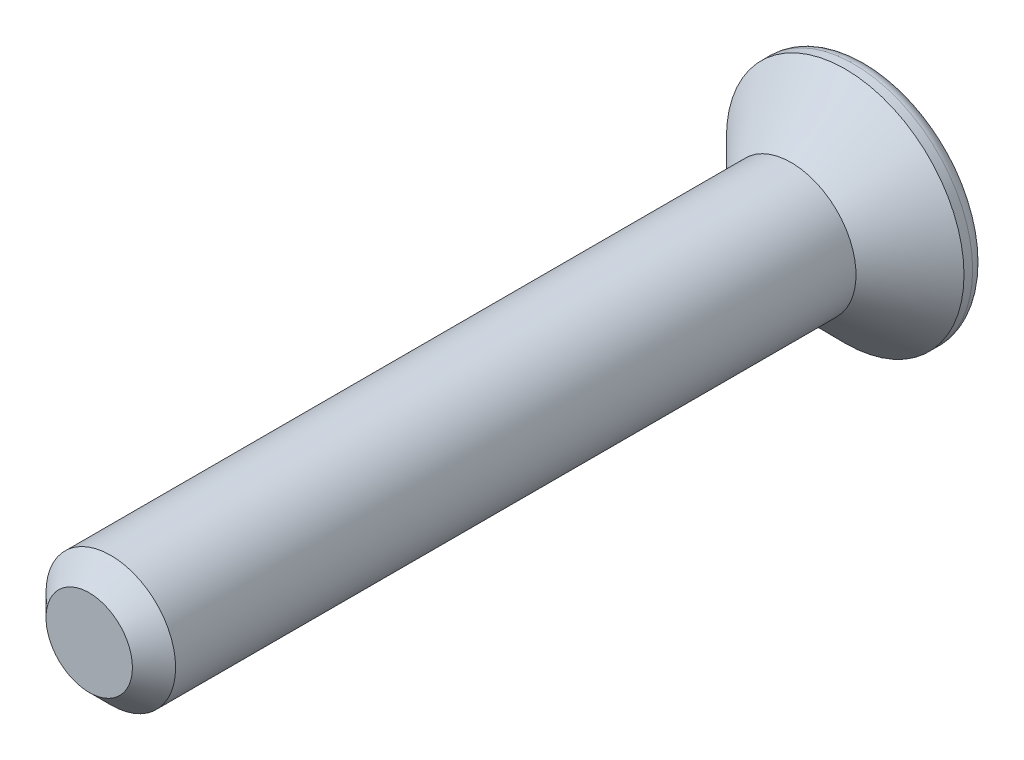
ISO-10303-21;
HEADER;
FILE_DESCRIPTION(('STEP AP214'),'2;1');
FILE_NAME('part.step','',(''),(''),'','','');
FILE_SCHEMA(('AUTOMOTIVE_DESIGN { 1 0 10303 214 1 1 1 1 }'));
ENDSEC;
DATA;
#1=APPLICATION_CONTEXT('core data for automotive mechanical design processes');
#2=APPLICATION_PROTOCOL_DEFINITION('international standard','automotive_design',2000,#1);
#3=PRODUCT_CONTEXT('',#1,'mechanical');
#4=PRODUCT('Part','Part','',(#3));
#5=PRODUCT_RELATED_PRODUCT_CATEGORY('part','',(#4));
#6=PRODUCT_DEFINITION_FORMATION('','',#4);
#7=PRODUCT_DEFINITION_CONTEXT('part definition',#1,'design');
#8=PRODUCT_DEFINITION('design','',#6,#7);
#9=PRODUCT_DEFINITION_SHAPE('','',#8);
#10=(LENGTH_UNIT() NAMED_UNIT(*) SI_UNIT(.MILLI.,.METRE.));
#11=(NAMED_UNIT(*) PLANE_ANGLE_UNIT() SI_UNIT($,.RADIAN.));
#12=(NAMED_UNIT(*) SI_UNIT($,.STERADIAN.) SOLID_ANGLE_UNIT());
#13=UNCERTAINTY_MEASURE_WITH_UNIT(LENGTH_MEASURE(1.E-05),#10,'distance_accuracy_value','');
#14=(GEOMETRIC_REPRESENTATION_CONTEXT(3) GLOBAL_UNCERTAINTY_ASSIGNED_CONTEXT((#13)) GLOBAL_UNIT_ASSIGNED_CONTEXT((#10,
#11,#12)) REPRESENTATION_CONTEXT('',''));
#15=CARTESIAN_POINT('',(0.,0.,0.));
#16=DIRECTION('',(0.,0.,1.));
#17=DIRECTION('',(1.,0.,0.));
#18=AXIS2_PLACEMENT_3D('',#15,#16,#17);
#19=CARTESIAN_POINT('',(0.,0.,2.));
#20=DIRECTION('',(0.,0.,-1.));
#21=DIRECTION('',(-1.,0.,0.));
#22=AXIS2_PLACEMENT_3D('',#19,#20,#21);
#23=CYLINDRICAL_SURFACE('',#22,2.75);
#24=CARTESIAN_POINT('',(0.,0.,0.3));
#25=DIRECTION('',(0.,0.,1.));
#26=DIRECTION('',(1.,0.,0.));
#27=AXIS2_PLACEMENT_3D('',#24,#25,#26);
#28=CIRCLE('',#27,2.75);
#29=CARTESIAN_POINT('',(2.75,0.,0.3));
#30=VERTEX_POINT('',#29);
#31=EDGE_CURVE('E179',#30,#30,#28,.T.);
#32=ORIENTED_EDGE('',*,*,#31,.T.);
#33=EDGE_LOOP('',(#32));
#34=FACE_BOUND('',#33,.T.);
#35=CARTESIAN_POINT('',(0.,0.,0.499999999999989));
#36=DIRECTION('',(0.,0.,1.));
#37=DIRECTION('',(1.,0.,0.));
#38=AXIS2_PLACEMENT_3D('',#35,#36,#37);
#39=CIRCLE('',#38,2.75);
#40=CARTESIAN_POINT('',(2.75,0.,0.499999999999989));
#41=VERTEX_POINT('',#40);
#42=EDGE_CURVE('E160',#41,#41,#39,.F.);
#43=ORIENTED_EDGE('',*,*,#42,.T.);
#44=EDGE_LOOP('',(#43));
#45=FACE_BOUND('',#44,.T.);
#46=ADVANCED_FACE('F39',(#34,#45),#23,.T.);
#47=CARTESIAN_POINT('',(0.,0.,0.));
#48=DIRECTION('',(0.,0.,1.));
#49=DIRECTION('',(1.,0.,0.));
#50=AXIS2_PLACEMENT_3D('',#47,#48,#49);
#51=PLANE('',#50);
#52=DIRECTION('',(-0.866025403784439,0.5,0.));
#53=VECTOR('',#52,1.);
#54=CARTESIAN_POINT('',(-0.775,-1.34233937586588,0.));
#55=LINE('',#54,#53);
#56=CARTESIAN_POINT('',(-1.55,-0.89489291724392,0.));
#57=VERTEX_POINT('',#56);
#58=CARTESIAN_POINT('',(0.,-1.78978583448784,0.));
#59=VERTEX_POINT('',#58);
#60=EDGE_CURVE('E209',#57,#59,#55,.F.);
#61=ORIENTED_EDGE('',*,*,#60,.T.);
#62=DIRECTION('',(-0.866025403784439,-0.5,0.));
#63=VECTOR('',#62,1.);
#64=CARTESIAN_POINT('',(0.775,-1.34233937586588,0.));
#65=LINE('',#64,#63);
#66=CARTESIAN_POINT('',(1.55,-0.89489291724392,0.));
#67=VERTEX_POINT('',#66);
#68=EDGE_CURVE('E212',#59,#67,#65,.F.);
#69=ORIENTED_EDGE('',*,*,#68,.T.);
#70=DIRECTION('',(0.,-1.,0.));
#71=VECTOR('',#70,1.);
#72=CARTESIAN_POINT('',(1.55,0.,0.));
#73=LINE('',#72,#71);
#74=CARTESIAN_POINT('',(1.55,0.89489291724392,0.));
#75=VERTEX_POINT('',#74);
#76=EDGE_CURVE('E197',#67,#75,#73,.F.);
#77=ORIENTED_EDGE('',*,*,#76,.T.);
#78=DIRECTION('',(0.866025403784439,-0.5,0.));
#79=VECTOR('',#78,1.);
#80=CARTESIAN_POINT('',(0.775,1.34233937586588,0.));
#81=LINE('',#80,#79);
#82=CARTESIAN_POINT('',(0.,1.78978583448784,0.));
#83=VERTEX_POINT('',#82);
#84=EDGE_CURVE('E200',#75,#83,#81,.F.);
#85=ORIENTED_EDGE('',*,*,#84,.T.);
#86=DIRECTION('',(0.866025403784439,0.5,0.));
#87=VECTOR('',#86,1.);
#88=CARTESIAN_POINT('',(-0.775,1.34233937586588,0.));
#89=LINE('',#88,#87);
#90=CARTESIAN_POINT('',(-1.55,0.894892917243921,0.));
#91=VERTEX_POINT('',#90);
#92=EDGE_CURVE('E203',#83,#91,#89,.F.);
#93=ORIENTED_EDGE('',*,*,#92,.T.);
#94=DIRECTION('',(0.,1.,0.));
#95=VECTOR('',#94,1.);
#96=CARTESIAN_POINT('',(-1.55,0.,0.));
#97=LINE('',#96,#95);
#98=EDGE_CURVE('E206',#91,#57,#97,.F.);
#99=ORIENTED_EDGE('',*,*,#98,.T.);
#100=EDGE_LOOP('',(#61,#69,#77,#85,#93,#99));
#101=FACE_BOUND('',#100,.T.);
#102=CARTESIAN_POINT('',(0.,0.,0.));
#103=DIRECTION('',(0.,0.,1.));
#104=DIRECTION('',(1.,0.,0.));
#105=AXIS2_PLACEMENT_3D('',#102,#103,#104);
#106=CIRCLE('',#105,2.45);
#107=CARTESIAN_POINT('',(2.45,0.,0.));
#108=VERTEX_POINT('',#107);
#109=EDGE_CURVE('E183',#108,#108,#106,.F.);
#110=ORIENTED_EDGE('',*,*,#109,.T.);
#111=EDGE_LOOP('',(#110));
#112=FACE_BOUND('',#111,.T.);
#113=ADVANCED_FACE('F276',(#101,#112),#51,.F.);
#114=CARTESIAN_POINT('',(0.,0.,18.));
#115=DIRECTION('',(0.,0.,-1.));
#116=DIRECTION('',(-1.,0.,0.));
#117=AXIS2_PLACEMENT_3D('',#114,#115,#116);
#118=CYLINDRICAL_SURFACE('',#117,1.5);
#119=CARTESIAN_POINT('',(0.,0.,17.5));
#120=DIRECTION('',(0.,0.,1.));
#121=DIRECTION('',(1.,0.,0.));
#122=AXIS2_PLACEMENT_3D('',#119,#120,#121);
#123=CIRCLE('',#122,1.5);
#124=CARTESIAN_POINT('',(1.5,0.,17.5));
#125=VERTEX_POINT('',#124);
#126=EDGE_CURVE('E191',#125,#125,#123,.F.);
#127=ORIENTED_EDGE('',*,*,#126,.T.);
#128=EDGE_LOOP('',(#127));
#129=FACE_BOUND('',#128,.T.);
#130=CARTESIAN_POINT('',(0.,0.,1.74999999999998));
#131=DIRECTION('',(0.,0.,-1.));
#132=DIRECTION('',(-1.,0.,0.));
#133=AXIS2_PLACEMENT_3D('',#130,#131,#132);
#134=CIRCLE('',#133,1.5);
#135=CARTESIAN_POINT('',(-1.5,0.,1.74999999999998));
#136=VERTEX_POINT('',#135);
#137=EDGE_CURVE('E175',#136,#136,#134,.F.);
#138=ORIENTED_EDGE('',*,*,#137,.T.);
#139=EDGE_LOOP('',(#138));
#140=FACE_BOUND('',#139,.T.);
#141=ADVANCED_FACE('F282',(#129,#140),#118,.T.);
#142=CARTESIAN_POINT('',(0.,0.,18.));
#143=DIRECTION('',(0.,0.,1.));
#144=DIRECTION('',(1.,0.,0.));
#145=AXIS2_PLACEMENT_3D('',#142,#143,#144);
#146=PLANE('',#145);
#147=CARTESIAN_POINT('',(0.,0.,18.));
#148=DIRECTION('',(0.,0.,1.));
#149=DIRECTION('',(1.,0.,0.));
#150=AXIS2_PLACEMENT_3D('',#147,#148,#149);
#151=CIRCLE('',#150,0.999999999999999);
#152=CARTESIAN_POINT('',(0.999999999999999,0.,18.));
#153=VERTEX_POINT('',#152);
#154=EDGE_CURVE('E187',#153,#153,#151,.T.);
#155=ORIENTED_EDGE('',*,*,#154,.T.);
#156=EDGE_LOOP('',(#155));
#157=FACE_BOUND('',#156,.T.);
#158=ADVANCED_FACE('F292',(#157),#146,.T.);
#159=CARTESIAN_POINT('',(0.,0.,2.));
#160=DIRECTION('',(0.,0.,-1.));
#161=DIRECTION('',(-1.,0.,0.));
#162=AXIS2_PLACEMENT_3D('',#159,#160,#161);
#163=CONICAL_SURFACE('',#162,1.24999999999997,0.785398163397453);
#164=ORIENTED_EDGE('',*,*,#42,.F.);
#165=EDGE_LOOP('',(#164));
#166=FACE_BOUND('',#165,.T.);
#167=ORIENTED_EDGE('',*,*,#137,.F.);
#168=EDGE_LOOP('',(#167));
#169=FACE_BOUND('',#168,.T.);
#170=ADVANCED_FACE('F288',(#166,#169),#163,.T.);
#171=CARTESIAN_POINT('',(0.,0.,0.3));
#172=DIRECTION('',(0.,0.,1.));
#173=DIRECTION('',(1.,0.,0.));
#174=AXIS2_PLACEMENT_3D('',#171,#172,#173);
#175=TOROIDAL_SURFACE('',#174,2.45,0.3);
#176=ORIENTED_EDGE('',*,*,#109,.F.);
#177=EDGE_LOOP('',(#176));
#178=FACE_BOUND('',#177,.T.);
#179=ORIENTED_EDGE('',*,*,#31,.F.);
#180=EDGE_LOOP('',(#179));
#181=FACE_BOUND('',#180,.T.);
#182=ADVANCED_FACE('F291',(#178,#181),#175,.T.);
#183=CARTESIAN_POINT('',(0.,0.,18.));
#184=DIRECTION('',(0.,0.,-1.));
#185=DIRECTION('',(-1.,0.,0.));
#186=AXIS2_PLACEMENT_3D('',#183,#184,#185);
#187=CONICAL_SURFACE('',#186,0.999999999999999,0.785398163397446);
#188=ORIENTED_EDGE('',*,*,#126,.F.);
#189=EDGE_LOOP('',(#188));
#190=FACE_BOUND('',#189,.T.);
#191=ORIENTED_EDGE('',*,*,#154,.F.);
#192=EDGE_LOOP('',(#191));
#193=FACE_BOUND('',#192,.T.);
#194=ADVANCED_FACE('F296',(#190,#193),#187,.T.);
#195=CARTESIAN_POINT('',(1.25,-0.721687836487032,2.));
#196=DIRECTION('',(0.5,-0.866025403784439,0.));
#197=DIRECTION('',(0.866025403784439,0.5,0.));
#198=AXIS2_PLACEMENT_3D('',#195,#196,#197);
#199=PLANE('',#198);
#200=DIRECTION('',(0.,0.,-1.));
#201=VECTOR('',#200,1.);
#202=CARTESIAN_POINT('',(1.25,-0.721687836487032,2.));
#203=LINE('',#202,#201);
#204=CARTESIAN_POINT('',(1.25,-0.721687836487032,2.));
#205=VERTEX_POINT('',#204);
#206=CARTESIAN_POINT('',(1.25,-0.721687836487032,0.3));
#207=VERTEX_POINT('',#206);
#208=EDGE_CURVE('E157',#205,#207,#203,.T.);
#209=ORIENTED_EDGE('',*,*,#208,.T.);
#210=DIRECTION('',(-0.866025403784439,-0.5,0.));
#211=VECTOR('',#210,1.);
#212=CARTESIAN_POINT('',(1.25,-0.721687836487032,0.3));
#213=LINE('',#212,#211);
#214=CARTESIAN_POINT('',(0.,-1.44337567297406,0.3));
#215=VERTEX_POINT('',#214);
#216=EDGE_CURVE('E121',#207,#215,#213,.T.);
#217=ORIENTED_EDGE('',*,*,#216,.T.);
#218=DIRECTION('',(0.,0.,-1.));
#219=VECTOR('',#218,1.);
#220=CARTESIAN_POINT('',(0.,-1.44337567297406,2.));
#221=LINE('',#220,#219);
#222=CARTESIAN_POINT('',(0.,-1.44337567297406,2.));
#223=VERTEX_POINT('',#222);
#224=EDGE_CURVE('E113',#223,#215,#221,.T.);
#225=ORIENTED_EDGE('',*,*,#224,.F.);
#226=DIRECTION('',(-0.866025403784439,-0.5,0.));
#227=VECTOR('',#226,1.);
#228=CARTESIAN_POINT('',(1.25,-0.721687836487032,2.));
#229=LINE('',#228,#227);
#230=EDGE_CURVE('E118',#205,#223,#229,.T.);
#231=ORIENTED_EDGE('',*,*,#230,.F.);
#232=EDGE_LOOP('',(#209,#217,#225,#231));
#233=FACE_BOUND('',#232,.T.);
#234=ADVANCED_FACE('F116',(#233),#199,.F.);
#235=CARTESIAN_POINT('',(1.25,0.721687836487032,2.));
#236=DIRECTION('',(1.,0.,0.));
#237=DIRECTION('',(0.,1.,0.));
#238=AXIS2_PLACEMENT_3D('',#235,#236,#237);
#239=PLANE('',#238);
#240=DIRECTION('',(0.,0.,-1.));
#241=VECTOR('',#240,1.);
#242=CARTESIAN_POINT('',(1.25,0.721687836487032,2.));
#243=LINE('',#242,#241);
#244=CARTESIAN_POINT('',(1.25,0.721687836487032,2.));
#245=VERTEX_POINT('',#244);
#246=CARTESIAN_POINT('',(1.25,0.721687836487032,0.3));
#247=VERTEX_POINT('',#246);
#248=EDGE_CURVE('E161',#245,#247,#243,.T.);
#249=ORIENTED_EDGE('',*,*,#248,.T.);
#250=DIRECTION('',(0.,-1.,0.));
#251=VECTOR('',#250,1.);
#252=CARTESIAN_POINT('',(1.25,0.721687836487032,0.3));
#253=LINE('',#252,#251);
#254=EDGE_CURVE('E11',#247,#207,#253,.T.);
#255=ORIENTED_EDGE('',*,*,#254,.T.);
#256=ORIENTED_EDGE('',*,*,#208,.F.);
#257=DIRECTION('',(0.,-1.,0.));
#258=VECTOR('',#257,1.);
#259=CARTESIAN_POINT('',(1.25,0.721687836487032,2.));
#260=LINE('',#259,#258);
#261=EDGE_CURVE('E125',#245,#205,#260,.T.);
#262=ORIENTED_EDGE('',*,*,#261,.F.);
#263=EDGE_LOOP('',(#249,#255,#256,#262));
#264=FACE_BOUND('',#263,.T.);
#265=ADVANCED_FACE('F260',(#264),#239,.F.);
#266=CARTESIAN_POINT('',(0.,1.44337567297406,2.));
#267=DIRECTION('',(0.5,0.866025403784439,0.));
#268=DIRECTION('',(-0.866025403784439,0.5,0.));
#269=AXIS2_PLACEMENT_3D('',#266,#267,#268);
#270=PLANE('',#269);
#271=DIRECTION('',(0.,0.,-1.));
#272=VECTOR('',#271,1.);
#273=CARTESIAN_POINT('',(0.,1.44337567297406,2.));
#274=LINE('',#273,#272);
#275=CARTESIAN_POINT('',(0.,1.44337567297406,2.));
#276=VERTEX_POINT('',#275);
#277=CARTESIAN_POINT('',(0.,1.44337567297406,0.3));
#278=VERTEX_POINT('',#277);
#279=EDGE_CURVE('E164',#276,#278,#274,.T.);
#280=ORIENTED_EDGE('',*,*,#279,.T.);
#281=DIRECTION('',(0.866025403784439,-0.5,0.));
#282=VECTOR('',#281,1.);
#283=CARTESIAN_POINT('',(0.,1.44337567297406,0.3));
#284=LINE('',#283,#282);
#285=EDGE_CURVE('E49',#278,#247,#284,.T.);
#286=ORIENTED_EDGE('',*,*,#285,.T.);
#287=ORIENTED_EDGE('',*,*,#248,.F.);
#288=DIRECTION('',(0.866025403784439,-0.5,0.));
#289=VECTOR('',#288,1.);
#290=CARTESIAN_POINT('',(0.,1.44337567297406,2.));
#291=LINE('',#290,#289);
#292=EDGE_CURVE('E152',#276,#245,#291,.T.);
#293=ORIENTED_EDGE('',*,*,#292,.F.);
#294=EDGE_LOOP('',(#280,#286,#287,#293));
#295=FACE_BOUND('',#294,.T.);
#296=ADVANCED_FACE('F262',(#295),#270,.F.);
#297=CARTESIAN_POINT('',(-1.25,0.721687836487033,2.));
#298=DIRECTION('',(-0.5,0.866025403784439,0.));
#299=DIRECTION('',(-0.866025403784439,-0.5,0.));
#300=AXIS2_PLACEMENT_3D('',#297,#298,#299);
#301=PLANE('',#300);
#302=DIRECTION('',(0.,0.,-1.));
#303=VECTOR('',#302,1.);
#304=CARTESIAN_POINT('',(-1.25,0.721687836487033,2.));
#305=LINE('',#304,#303);
#306=CARTESIAN_POINT('',(-1.25,0.721687836487033,2.));
#307=VERTEX_POINT('',#306);
#308=CARTESIAN_POINT('',(-1.25,0.721687836487033,0.3));
#309=VERTEX_POINT('',#308);
#310=EDGE_CURVE('E167',#307,#309,#305,.T.);
#311=ORIENTED_EDGE('',*,*,#310,.T.);
#312=DIRECTION('',(0.866025403784439,0.5,0.));
#313=VECTOR('',#312,1.);
#314=CARTESIAN_POINT('',(-1.25,0.721687836487033,0.3));
#315=LINE('',#314,#313);
#316=EDGE_CURVE('E64',#309,#278,#315,.T.);
#317=ORIENTED_EDGE('',*,*,#316,.T.);
#318=ORIENTED_EDGE('',*,*,#279,.F.);
#319=DIRECTION('',(0.866025403784439,0.5,0.));
#320=VECTOR('',#319,1.);
#321=CARTESIAN_POINT('',(-1.25,0.721687836487033,2.));
#322=LINE('',#321,#320);
#323=EDGE_CURVE('E148',#307,#276,#322,.T.);
#324=ORIENTED_EDGE('',*,*,#323,.F.);
#325=EDGE_LOOP('',(#311,#317,#318,#324));
#326=FACE_BOUND('',#325,.T.);
#327=ADVANCED_FACE('F264',(#326),#301,.F.);
#328=CARTESIAN_POINT('',(-1.25,-0.721687836487032,2.));
#329=DIRECTION('',(-1.,0.,0.));
#330=DIRECTION('',(0.,0.,1.));
#331=AXIS2_PLACEMENT_3D('',#328,#329,#330);
#332=PLANE('',#331);
#333=DIRECTION('',(0.,0.,-1.));
#334=VECTOR('',#333,1.);
#335=CARTESIAN_POINT('',(-1.25,-0.721687836487032,2.));
#336=LINE('',#335,#334);
#337=CARTESIAN_POINT('',(-1.25,-0.721687836487032,2.));
#338=VERTEX_POINT('',#337);
#339=CARTESIAN_POINT('',(-1.25,-0.721687836487032,0.3));
#340=VERTEX_POINT('',#339);
#341=EDGE_CURVE('E124',#338,#340,#336,.T.);
#342=ORIENTED_EDGE('',*,*,#341,.T.);
#343=DIRECTION('',(0.,1.,0.));
#344=VECTOR('',#343,1.);
#345=CARTESIAN_POINT('',(-1.25,-0.721687836487032,0.3));
#346=LINE('',#345,#344);
#347=EDGE_CURVE('E219',#340,#309,#346,.T.);
#348=ORIENTED_EDGE('',*,*,#347,.T.);
#349=ORIENTED_EDGE('',*,*,#310,.F.);
#350=DIRECTION('',(0.,1.,0.));
#351=VECTOR('',#350,1.);
#352=CARTESIAN_POINT('',(-1.25,-0.721687836487032,2.));
#353=LINE('',#352,#351);
#354=EDGE_CURVE('E135',#338,#307,#353,.T.);
#355=ORIENTED_EDGE('',*,*,#354,.F.);
#356=EDGE_LOOP('',(#342,#348,#349,#355));
#357=FACE_BOUND('',#356,.T.);
#358=ADVANCED_FACE('F266',(#357),#332,.F.);
#359=CARTESIAN_POINT('',(0.,-1.44337567297406,2.));
#360=DIRECTION('',(-0.5,-0.866025403784439,0.));
#361=DIRECTION('',(0.866025403784439,-0.5,0.));
#362=AXIS2_PLACEMENT_3D('',#359,#360,#361);
#363=PLANE('',#362);
#364=ORIENTED_EDGE('',*,*,#224,.T.);
#365=DIRECTION('',(-0.866025403784439,0.5,0.));
#366=VECTOR('',#365,1.);
#367=CARTESIAN_POINT('',(0.,-1.44337567297406,0.3));
#368=LINE('',#367,#366);
#369=EDGE_CURVE('E216',#215,#340,#368,.T.);
#370=ORIENTED_EDGE('',*,*,#369,.T.);
#371=ORIENTED_EDGE('',*,*,#341,.F.);
#372=DIRECTION('',(-0.866025403784439,0.5,0.));
#373=VECTOR('',#372,1.);
#374=CARTESIAN_POINT('',(0.,-1.44337567297406,2.));
#375=LINE('',#374,#373);
#376=EDGE_CURVE('E128',#223,#338,#375,.T.);
#377=ORIENTED_EDGE('',*,*,#376,.F.);
#378=EDGE_LOOP('',(#364,#370,#371,#377));
#379=FACE_BOUND('',#378,.T.);
#380=ADVANCED_FACE('F129',(#379),#363,.F.);
#381=CARTESIAN_POINT('',(0.,0.,2.));
#382=DIRECTION('',(0.,0.,-1.));
#383=DIRECTION('',(-1.,0.,0.));
#384=AXIS2_PLACEMENT_3D('',#381,#382,#383);
#385=PLANE('',#384);
#386=ORIENTED_EDGE('',*,*,#230,.T.);
#387=ORIENTED_EDGE('',*,*,#376,.T.);
#388=ORIENTED_EDGE('',*,*,#354,.T.);
#389=ORIENTED_EDGE('',*,*,#323,.T.);
#390=ORIENTED_EDGE('',*,*,#292,.T.);
#391=ORIENTED_EDGE('',*,*,#261,.T.);
#392=EDGE_LOOP('',(#386,#387,#388,#389,#390,#391));
#393=FACE_BOUND('',#392,.T.);
#394=ADVANCED_FACE('F137',(#393),#385,.T.);
#395=CARTESIAN_POINT('',(-1.4,0.981495457622364,0.3));
#396=DIRECTION('',(0.866025403784439,0.5,0.));
#397=DIRECTION('',(-0.5,0.866025403784439,0.));
#398=AXIS2_PLACEMENT_3D('',#395,#396,#397);
#399=CYLINDRICAL_SURFACE('',#398,0.3);
#400=CARTESIAN_POINT('',(-1.55,0.894892917243921,0.3));
#401=DIRECTION('',(0.5,0.866025403784439,0.));
#402=DIRECTION('',(-0.866025403784439,0.5,0.));
#403=AXIS2_PLACEMENT_3D('',#400,#401,#402);
#404=ELLIPSE('',#403,0.346410161513775,0.3);
#405=EDGE_CURVE('E144',#91,#309,#404,.F.);
#406=ORIENTED_EDGE('',*,*,#405,.F.);
#407=ORIENTED_EDGE('',*,*,#92,.F.);
#408=CARTESIAN_POINT('',(0.,1.78978583448784,0.3));
#409=DIRECTION('',(1.,0.,0.));
#410=DIRECTION('',(0.,1.,0.));
#411=AXIS2_PLACEMENT_3D('',#408,#409,#410);
#412=ELLIPSE('',#411,0.346410161513775,0.3);
#413=EDGE_CURVE('E43',#278,#83,#412,.T.);
#414=ORIENTED_EDGE('',*,*,#413,.F.);
#415=ORIENTED_EDGE('',*,*,#316,.F.);
#416=EDGE_LOOP('',(#406,#407,#414,#415));
#417=FACE_BOUND('',#416,.T.);
#418=ADVANCED_FACE('F41',(#417),#399,.T.);
#419=CARTESIAN_POINT('',(0.15,1.7031832941094,0.3));
#420=DIRECTION('',(0.866025403784439,-0.5,0.));
#421=DIRECTION('',(0.5,0.866025403784439,0.));
#422=AXIS2_PLACEMENT_3D('',#419,#420,#421);
#423=CYLINDRICAL_SURFACE('',#422,0.3);
#424=ORIENTED_EDGE('',*,*,#413,.T.);
#425=ORIENTED_EDGE('',*,*,#84,.F.);
#426=CARTESIAN_POINT('',(1.55,0.89489291724392,0.3));
#427=DIRECTION('',(0.5,-0.866025403784439,0.));
#428=DIRECTION('',(0.866025403784439,0.5,0.));
#429=AXIS2_PLACEMENT_3D('',#426,#427,#428);
#430=ELLIPSE('',#429,0.346410161513775,0.3);
#431=EDGE_CURVE('E236',#247,#75,#430,.T.);
#432=ORIENTED_EDGE('',*,*,#431,.F.);
#433=ORIENTED_EDGE('',*,*,#285,.F.);
#434=EDGE_LOOP('',(#424,#425,#432,#433));
#435=FACE_BOUND('',#434,.T.);
#436=ADVANCED_FACE('F253',(#435),#423,.T.);
#437=CARTESIAN_POINT('',(-1.55,-0.721687836487032,0.3));
#438=DIRECTION('',(0.,1.,0.));
#439=DIRECTION('',(0.,0.,1.));
#440=AXIS2_PLACEMENT_3D('',#437,#438,#439);
#441=CYLINDRICAL_SURFACE('',#440,0.3);
#442=ORIENTED_EDGE('',*,*,#405,.T.);
#443=ORIENTED_EDGE('',*,*,#347,.F.);
#444=CARTESIAN_POINT('',(-1.55,-0.89489291724392,0.3));
#445=DIRECTION('',(-0.5,0.866025403784439,0.));
#446=DIRECTION('',(-0.866025403784439,-0.5,0.));
#447=AXIS2_PLACEMENT_3D('',#444,#445,#446);
#448=ELLIPSE('',#447,0.346410161513775,0.3);
#449=EDGE_CURVE('E232',#57,#340,#448,.F.);
#450=ORIENTED_EDGE('',*,*,#449,.F.);
#451=ORIENTED_EDGE('',*,*,#98,.F.);
#452=EDGE_LOOP('',(#442,#443,#450,#451));
#453=FACE_BOUND('',#452,.T.);
#454=ADVANCED_FACE('F245',(#453),#441,.T.);
#455=CARTESIAN_POINT('',(1.55,0.721687836487033,0.3));
#456=DIRECTION('',(0.,-1.,0.));
#457=DIRECTION('',(1.,0.,0.));
#458=AXIS2_PLACEMENT_3D('',#455,#456,#457);
#459=CYLINDRICAL_SURFACE('',#458,0.3);
#460=ORIENTED_EDGE('',*,*,#431,.T.);
#461=ORIENTED_EDGE('',*,*,#76,.F.);
#462=CARTESIAN_POINT('',(1.55,-0.89489291724392,0.3));
#463=DIRECTION('',(-0.5,-0.866025403784439,0.));
#464=DIRECTION('',(-0.866025403784439,0.5,0.));
#465=AXIS2_PLACEMENT_3D('',#462,#463,#464);
#466=ELLIPSE('',#465,0.346410161513775,0.3);
#467=EDGE_CURVE('E229',#207,#67,#466,.T.);
#468=ORIENTED_EDGE('',*,*,#467,.F.);
#469=ORIENTED_EDGE('',*,*,#254,.F.);
#470=EDGE_LOOP('',(#460,#461,#468,#469));
#471=FACE_BOUND('',#470,.T.);
#472=ADVANCED_FACE('F258',(#471),#459,.T.);
#473=CARTESIAN_POINT('',(-0.15,-1.7031832941094,0.3));
#474=DIRECTION('',(-0.866025403784439,0.5,0.));
#475=DIRECTION('',(-0.5,-0.866025403784439,0.));
#476=AXIS2_PLACEMENT_3D('',#473,#474,#475);
#477=CYLINDRICAL_SURFACE('',#476,0.3);
#478=ORIENTED_EDGE('',*,*,#449,.T.);
#479=ORIENTED_EDGE('',*,*,#369,.F.);
#480=CARTESIAN_POINT('',(0.,-1.78978583448784,0.3));
#481=DIRECTION('',(-1.,0.,0.));
#482=DIRECTION('',(0.,-1.,0.));
#483=AXIS2_PLACEMENT_3D('',#480,#481,#482);
#484=ELLIPSE('',#483,0.346410161513775,0.3);
#485=EDGE_CURVE('E226',#59,#215,#484,.F.);
#486=ORIENTED_EDGE('',*,*,#485,.F.);
#487=ORIENTED_EDGE('',*,*,#60,.F.);
#488=EDGE_LOOP('',(#478,#479,#486,#487));
#489=FACE_BOUND('',#488,.T.);
#490=ADVANCED_FACE('F304',(#489),#477,.T.);
#491=CARTESIAN_POINT('',(1.4,-0.981495457622364,0.3));
#492=DIRECTION('',(-0.866025403784439,-0.5,0.));
#493=DIRECTION('',(0.5,-0.866025403784439,0.));
#494=AXIS2_PLACEMENT_3D('',#491,#492,#493);
#495=CYLINDRICAL_SURFACE('',#494,0.3);
#496=ORIENTED_EDGE('',*,*,#467,.T.);
#497=ORIENTED_EDGE('',*,*,#68,.F.);
#498=ORIENTED_EDGE('',*,*,#485,.T.);
#499=ORIENTED_EDGE('',*,*,#216,.F.);
#500=EDGE_LOOP('',(#496,#497,#498,#499));
#501=FACE_BOUND('',#500,.T.);
#502=ADVANCED_FACE('F301',(#501),#495,.T.);
#503=CLOSED_SHELL('',(#46,#113,#141,#158,#170,#182,#194,#234,#265,#296,#327,#358,#380,#394,#418,
#436,#454,#472,#490,#502));
#504=MANIFOLD_SOLID_BREP('B2',#503);
#505=ADVANCED_BREP_SHAPE_REPRESENTATION('',(#18,#504),#14);
#506=SHAPE_DEFINITION_REPRESENTATION(#9,#505);
ENDSEC;
END-ISO-10303-21;
